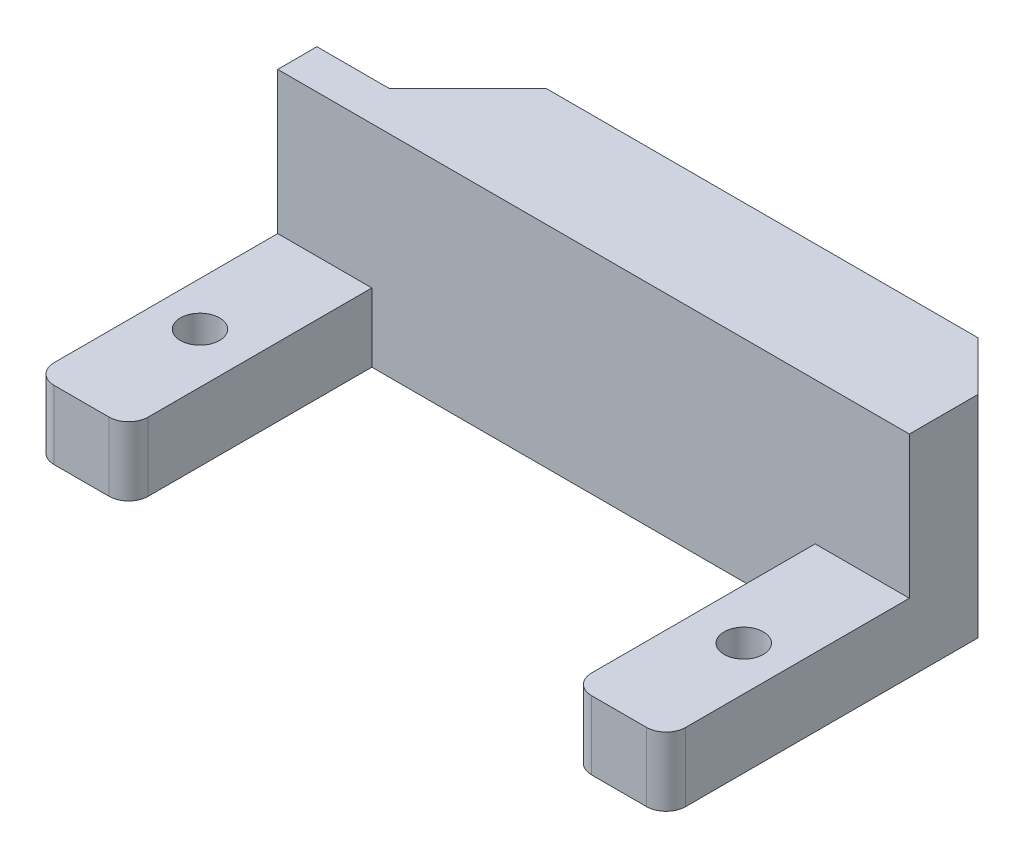
ISO-10303-21;
HEADER;
FILE_DESCRIPTION(('STEP AP214'),'2;1');
FILE_NAME('part.step','',(''),(''),'','','');
FILE_SCHEMA(('AUTOMOTIVE_DESIGN { 1 0 10303 214 1 1 1 1 }'));
ENDSEC;
DATA;
#1=APPLICATION_CONTEXT('core data for automotive mechanical design processes');
#2=APPLICATION_PROTOCOL_DEFINITION('international standard','automotive_design',2000,#1);
#3=PRODUCT_CONTEXT('',#1,'mechanical');
#4=PRODUCT('Part','Part','',(#3));
#5=PRODUCT_RELATED_PRODUCT_CATEGORY('part','',(#4));
#6=PRODUCT_DEFINITION_FORMATION('','',#4);
#7=PRODUCT_DEFINITION_CONTEXT('part definition',#1,'design');
#8=PRODUCT_DEFINITION('design','',#6,#7);
#9=PRODUCT_DEFINITION_SHAPE('','',#8);
#10=(LENGTH_UNIT() NAMED_UNIT(*) SI_UNIT(.MILLI.,.METRE.));
#11=(NAMED_UNIT(*) PLANE_ANGLE_UNIT() SI_UNIT($,.RADIAN.));
#12=(NAMED_UNIT(*) SI_UNIT($,.STERADIAN.) SOLID_ANGLE_UNIT());
#13=UNCERTAINTY_MEASURE_WITH_UNIT(LENGTH_MEASURE(1.E-05),#10,'distance_accuracy_value','');
#14=(GEOMETRIC_REPRESENTATION_CONTEXT(3) GLOBAL_UNCERTAINTY_ASSIGNED_CONTEXT((#13)) GLOBAL_UNIT_ASSIGNED_CONTEXT((#10,
#11,#12)) REPRESENTATION_CONTEXT('',''));
#15=CARTESIAN_POINT('',(0.,0.,0.));
#16=DIRECTION('',(0.,0.,1.));
#17=DIRECTION('',(1.,0.,0.));
#18=AXIS2_PLACEMENT_3D('',#15,#16,#17);
#19=CARTESIAN_POINT('',(12.8287010787249,25.306137529213,-5.11908373632079));
#20=DIRECTION('',(0.,-1.,0.));
#21=DIRECTION('',(0.,0.,1.));
#22=AXIS2_PLACEMENT_3D('',#19,#20,#21);
#23=PLANE('',#22);
#24=DIRECTION('',(-1.,0.,0.));
#25=VECTOR('',#24,1.);
#26=CARTESIAN_POINT('',(12.8287010787249,25.306137529213,-4.09908373632079));
#27=LINE('',#26,#25);
#28=CARTESIAN_POINT('',(13.8487010787249,25.306137529213,-4.09908373632079));
#29=VERTEX_POINT('',#28);
#30=CARTESIAN_POINT('',(-8.59129892127512,25.306137529213,-4.09908373632079));
#31=VERTEX_POINT('',#30);
#32=EDGE_CURVE('E202',#29,#31,#27,.T.);
#33=ORIENTED_EDGE('',*,*,#32,.T.);
#34=DIRECTION('',(-0.707106781186546,0.,0.707106781186549));
#35=VECTOR('',#34,1.);
#36=CARTESIAN_POINT('',(2.62870107872484,25.306137529213,-15.3190837363208));
#37=LINE('',#36,#35);
#38=CARTESIAN_POINT('',(-12.6712989212751,25.306137529213,-0.0190837363207937));
#39=VERTEX_POINT('',#38);
#40=EDGE_CURVE('E417',#39,#31,#37,.F.);
#41=ORIENTED_EDGE('',*,*,#40,.F.);
#42=DIRECTION('',(1.,0.,0.));
#43=VECTOR('',#42,1.);
#44=CARTESIAN_POINT('',(-0.02329892127513,25.306137529213,-0.0190837363207937));
#45=LINE('',#44,#43);
#46=CARTESIAN_POINT('',(-16.4452989212751,25.306137529213,-0.0190837363207937));
#47=VERTEX_POINT('',#46);
#48=EDGE_CURVE('E285',#47,#39,#45,.T.);
#49=ORIENTED_EDGE('',*,*,#48,.F.);
#50=DIRECTION('',(0.,0.,-1.));
#51=VECTOR('',#50,1.);
#52=CARTESIAN_POINT('',(-16.4452989212751,25.306137529213,14.6689162636792));
#53=LINE('',#52,#51);
#54=CARTESIAN_POINT('',(-16.4452989212751,25.306137529213,2.02091626367921));
#55=VERTEX_POINT('',#54);
#56=EDGE_CURVE('E290',#55,#47,#53,.T.);
#57=ORIENTED_EDGE('',*,*,#56,.F.);
#58=DIRECTION('',(1.,0.,0.));
#59=VECTOR('',#58,1.);
#60=CARTESIAN_POINT('',(-0.02329892127513,25.306137529213,2.02091626367921));
#61=LINE('',#60,#59);
#62=CARTESIAN_POINT('',(16.3987010787249,25.306137529213,2.02091626367921));
#63=VERTEX_POINT('',#62);
#64=EDGE_CURVE('E294',#55,#63,#61,.T.);
#65=ORIENTED_EDGE('',*,*,#64,.T.);
#66=DIRECTION('',(0.,0.,1.));
#67=VECTOR('',#66,1.);
#68=CARTESIAN_POINT('',(16.3987010787249,25.306137529213,14.6689162636792));
#69=LINE('',#68,#67);
#70=CARTESIAN_POINT('',(16.3987010787249,25.306137529213,-1.54908373632082));
#71=VERTEX_POINT('',#70);
#72=EDGE_CURVE('E284',#71,#63,#69,.T.);
#73=ORIENTED_EDGE('',*,*,#72,.F.);
#74=DIRECTION('',(-0.70710678118655,0.,-0.707106781186545));
#75=VECTOR('',#74,1.);
#76=CARTESIAN_POINT('',(12.8287010787249,25.306137529213,-5.11908373632079));
#77=LINE('',#76,#75);
#78=EDGE_CURVE('E421',#29,#71,#77,.F.);
#79=ORIENTED_EDGE('',*,*,#78,.F.);
#80=EDGE_LOOP('',(#33,#41,#49,#57,#65,#73,#79));
#81=FACE_BOUND('',#80,.T.);
#82=ADVANCED_FACE('F41',(#81),#23,.F.);
#83=CARTESIAN_POINT('',(-7.57129892127513,23.266137529213,-5.11908373632079));
#84=DIRECTION('',(-0.707106781186549,0.,-0.707106781186546));
#85=DIRECTION('',(0.,1.,0.));
#86=AXIS2_PLACEMENT_3D('',#83,#84,#85);
#87=PLANE('',#86);
#88=DIRECTION('',(0.,1.,0.));
#89=VECTOR('',#88,1.);
#90=CARTESIAN_POINT('',(-8.59129892127512,23.266137529213,-4.09908373632079));
#91=LINE('',#90,#89);
#92=CARTESIAN_POINT('',(-8.59129892127512,14.341137529213,-4.09908373632079));
#93=VERTEX_POINT('',#92);
#94=EDGE_CURVE('E204',#31,#93,#91,.F.);
#95=ORIENTED_EDGE('',*,*,#94,.T.);
#96=DIRECTION('',(-0.707106781186546,0.,0.707106781186549));
#97=VECTOR('',#96,1.);
#98=CARTESIAN_POINT('',(-7.57129892127513,14.341137529213,-5.11908373632079));
#99=LINE('',#98,#97);
#100=CARTESIAN_POINT('',(-12.6712989212751,14.341137529213,-0.0190837363207937));
#101=VERTEX_POINT('',#100);
#102=EDGE_CURVE('E189',#93,#101,#99,.T.);
#103=ORIENTED_EDGE('',*,*,#102,.T.);
#104=DIRECTION('',(0.,1.,0.));
#105=VECTOR('',#104,1.);
#106=CARTESIAN_POINT('',(-12.6712989212751,25.306137529213,-0.0190837363207937));
#107=LINE('',#106,#105);
#108=EDGE_CURVE('E414',#101,#39,#107,.T.);
#109=ORIENTED_EDGE('',*,*,#108,.T.);
#110=ORIENTED_EDGE('',*,*,#40,.T.);
#111=EDGE_LOOP('',(#95,#103,#109,#110));
#112=FACE_BOUND('',#111,.T.);
#113=ADVANCED_FACE('F463',(#112),#87,.T.);
#114=CARTESIAN_POINT('',(12.8287010787249,23.266137529213,-5.11908373632079));
#115=DIRECTION('',(0.707106781186545,0.,-0.70710678118655));
#116=DIRECTION('',(0.,-1.,0.));
#117=AXIS2_PLACEMENT_3D('',#114,#115,#116);
#118=PLANE('',#117);
#119=DIRECTION('',(0.,-1.,0.));
#120=VECTOR('',#119,1.);
#121=CARTESIAN_POINT('',(13.8487010787249,23.266137529213,-4.09908373632079));
#122=LINE('',#121,#120);
#123=CARTESIAN_POINT('',(13.8487010787249,14.341137529213,-4.09908373632079));
#124=VERTEX_POINT('',#123);
#125=EDGE_CURVE('E193',#124,#29,#122,.F.);
#126=ORIENTED_EDGE('',*,*,#125,.T.);
#127=ORIENTED_EDGE('',*,*,#78,.T.);
#128=DIRECTION('',(0.,1.,0.));
#129=VECTOR('',#128,1.);
#130=CARTESIAN_POINT('',(16.3987010787249,15.871137529213,-1.54908373632082));
#131=LINE('',#130,#129);
#132=CARTESIAN_POINT('',(16.3987010787249,14.341137529213,-1.54908373632082));
#133=VERTEX_POINT('',#132);
#134=EDGE_CURVE('E50',#71,#133,#131,.F.);
#135=ORIENTED_EDGE('',*,*,#134,.T.);
#136=DIRECTION('',(-0.70710678118655,0.,-0.707106781186545));
#137=VECTOR('',#136,1.);
#138=CARTESIAN_POINT('',(16.3987010787249,14.341137529213,-1.54908373632082));
#139=LINE('',#138,#137);
#140=EDGE_CURVE('E186',#133,#124,#139,.T.);
#141=ORIENTED_EDGE('',*,*,#140,.T.);
#142=EDGE_LOOP('',(#126,#127,#135,#141));
#143=FACE_BOUND('',#142,.T.);
#144=ADVANCED_FACE('F43',(#143),#118,.T.);
#145=CARTESIAN_POINT('',(15.3787010787249,14.341137529213,13.6489162636792));
#146=DIRECTION('',(0.,-1.,0.));
#147=DIRECTION('',(0.,0.,1.));
#148=AXIS2_PLACEMENT_3D('',#145,#146,#147);
#149=PLANE('',#148);
#150=CARTESIAN_POINT('',(14.1139010787249,14.341137529213,8.34802470056417));
#151=DIRECTION('',(0.,1.,0.));
#152=DIRECTION('',(0.,0.,1.));
#153=AXIS2_PLACEMENT_3D('',#150,#151,#152);
#154=CIRCLE('',#153,1.02);
#155=CARTESIAN_POINT('',(14.1139010787249,14.341137529213,9.36802470056417));
#156=VERTEX_POINT('',#155);
#157=EDGE_CURVE('E229',#156,#156,#154,.T.);
#158=ORIENTED_EDGE('',*,*,#157,.T.);
#159=EDGE_LOOP('',(#158));
#160=FACE_BOUND('',#159,.T.);
#161=CARTESIAN_POINT('',(-14.1604989212751,14.341137529213,8.34802470056417));
#162=DIRECTION('',(0.,1.,0.));
#163=DIRECTION('',(0.,0.,1.));
#164=AXIS2_PLACEMENT_3D('',#161,#162,#163);
#165=CIRCLE('',#164,1.02);
#166=CARTESIAN_POINT('',(-14.1604989212751,14.341137529213,9.36802470056417));
#167=VERTEX_POINT('',#166);
#168=EDGE_CURVE('E225',#167,#167,#165,.T.);
#169=ORIENTED_EDGE('',*,*,#168,.T.);
#170=EDGE_LOOP('',(#169));
#171=FACE_BOUND('',#170,.T.);
#172=ORIENTED_EDGE('',*,*,#140,.F.);
#173=DIRECTION('',(0.,0.,-1.));
#174=VECTOR('',#173,1.);
#175=CARTESIAN_POINT('',(16.3987010787249,14.341137529213,13.6489162636792));
#176=LINE('',#175,#174);
#177=CARTESIAN_POINT('',(16.3987010787249,14.341137529213,13.6489162636792));
#178=VERTEX_POINT('',#177);
#179=EDGE_CURVE('E196',#178,#133,#176,.T.);
#180=ORIENTED_EDGE('',*,*,#179,.F.);
#181=CARTESIAN_POINT('',(15.3787010787249,14.341137529213,13.6489162636792));
#182=DIRECTION('',(0.,1.,0.));
#183=DIRECTION('',(0.,0.,1.));
#184=AXIS2_PLACEMENT_3D('',#181,#182,#183);
#185=CIRCLE('',#184,1.02);
#186=CARTESIAN_POINT('',(15.3787010787249,14.341137529213,14.6689162636792));
#187=VERTEX_POINT('',#186);
#188=EDGE_CURVE('E233',#187,#178,#185,.T.);
#189=ORIENTED_EDGE('',*,*,#188,.F.);
#190=DIRECTION('',(1.,0.,0.));
#191=VECTOR('',#190,1.);
#192=CARTESIAN_POINT('',(12.5227010787249,14.341137529213,14.6689162636792));
#193=LINE('',#192,#191);
#194=CARTESIAN_POINT('',(12.5227010787249,14.341137529213,14.6689162636792));
#195=VERTEX_POINT('',#194);
#196=EDGE_CURVE('E277',#195,#187,#193,.T.);
#197=ORIENTED_EDGE('',*,*,#196,.F.);
#198=CARTESIAN_POINT('',(12.5227010787249,14.341137529213,13.6489162636792));
#199=DIRECTION('',(0.,1.,0.));
#200=DIRECTION('',(0.,0.,1.));
#201=AXIS2_PLACEMENT_3D('',#198,#199,#200);
#202=CIRCLE('',#201,1.02);
#203=CARTESIAN_POINT('',(11.5027010787249,14.341137529213,13.6489162636792));
#204=VERTEX_POINT('',#203);
#205=EDGE_CURVE('E273',#204,#195,#202,.T.);
#206=ORIENTED_EDGE('',*,*,#205,.F.);
#207=DIRECTION('',(0.,0.,1.));
#208=VECTOR('',#207,1.);
#209=CARTESIAN_POINT('',(11.5027010787249,14.341137529213,2.02091626367921));
#210=LINE('',#209,#208);
#211=CARTESIAN_POINT('',(11.5027010787249,14.341137529213,2.02091626367921));
#212=VERTEX_POINT('',#211);
#213=EDGE_CURVE('E269',#212,#204,#210,.T.);
#214=ORIENTED_EDGE('',*,*,#213,.F.);
#215=DIRECTION('',(1.,0.,0.));
#216=VECTOR('',#215,1.);
#217=CARTESIAN_POINT('',(-11.5492989212751,14.341137529213,2.02091626367921));
#218=LINE('',#217,#216);
#219=CARTESIAN_POINT('',(-11.5492989212751,14.341137529213,2.02091626367921));
#220=VERTEX_POINT('',#219);
#221=EDGE_CURVE('E265',#220,#212,#218,.T.);
#222=ORIENTED_EDGE('',*,*,#221,.F.);
#223=DIRECTION('',(0.,0.,-1.));
#224=VECTOR('',#223,1.);
#225=CARTESIAN_POINT('',(-11.5492989212751,14.341137529213,13.6489162636792));
#226=LINE('',#225,#224);
#227=CARTESIAN_POINT('',(-11.5492989212751,14.341137529213,13.6489162636792));
#228=VERTEX_POINT('',#227);
#229=EDGE_CURVE('E261',#228,#220,#226,.T.);
#230=ORIENTED_EDGE('',*,*,#229,.F.);
#231=CARTESIAN_POINT('',(-12.5692989212751,14.341137529213,13.6489162636792));
#232=DIRECTION('',(0.,1.,0.));
#233=DIRECTION('',(0.,0.,1.));
#234=AXIS2_PLACEMENT_3D('',#231,#232,#233);
#235=CIRCLE('',#234,1.02);
#236=CARTESIAN_POINT('',(-12.5692989212751,14.341137529213,14.6689162636792));
#237=VERTEX_POINT('',#236);
#238=EDGE_CURVE('E257',#237,#228,#235,.T.);
#239=ORIENTED_EDGE('',*,*,#238,.F.);
#240=DIRECTION('',(1.,0.,0.));
#241=VECTOR('',#240,1.);
#242=CARTESIAN_POINT('',(-15.4252989212751,14.341137529213,14.6689162636792));
#243=LINE('',#242,#241);
#244=CARTESIAN_POINT('',(-15.4252989212751,14.341137529213,14.6689162636792));
#245=VERTEX_POINT('',#244);
#246=EDGE_CURVE('E253',#245,#237,#243,.T.);
#247=ORIENTED_EDGE('',*,*,#246,.F.);
#248=CARTESIAN_POINT('',(-15.4252989212751,14.341137529213,13.6489162636792));
#249=DIRECTION('',(0.,1.,0.));
#250=DIRECTION('',(0.,0.,1.));
#251=AXIS2_PLACEMENT_3D('',#248,#249,#250);
#252=CIRCLE('',#251,1.02);
#253=CARTESIAN_POINT('',(-16.4452989212751,14.341137529213,13.6489162636792));
#254=VERTEX_POINT('',#253);
#255=EDGE_CURVE('E249',#254,#245,#252,.T.);
#256=ORIENTED_EDGE('',*,*,#255,.F.);
#257=DIRECTION('',(0.,0.,1.));
#258=VECTOR('',#257,1.);
#259=CARTESIAN_POINT('',(-16.4452989212751,14.341137529213,-0.0190837363207937));
#260=LINE('',#259,#258);
#261=CARTESIAN_POINT('',(-16.4452989212751,14.341137529213,-0.0190837363207937));
#262=VERTEX_POINT('',#261);
#263=EDGE_CURVE('E245',#262,#254,#260,.T.);
#264=ORIENTED_EDGE('',*,*,#263,.F.);
#265=DIRECTION('',(-1.,0.,0.));
#266=VECTOR('',#265,1.);
#267=CARTESIAN_POINT('',(-12.6712989212751,14.341137529213,-0.0190837363207937));
#268=LINE('',#267,#266);
#269=EDGE_CURVE('E241',#101,#262,#268,.T.);
#270=ORIENTED_EDGE('',*,*,#269,.F.);
#271=ORIENTED_EDGE('',*,*,#102,.F.);
#272=DIRECTION('',(-1.,0.,0.));
#273=VECTOR('',#272,1.);
#274=CARTESIAN_POINT('',(15.3787010787249,14.341137529213,-4.09908373632079));
#275=LINE('',#274,#273);
#276=EDGE_CURVE('E11',#124,#93,#275,.T.);
#277=ORIENTED_EDGE('',*,*,#276,.F.);
#278=EDGE_LOOP('',(#172,#180,#189,#197,#206,#214,#222,#230,#239,#247,#256,#264,#270,#271,#277));
#279=FACE_BOUND('',#278,.T.);
#280=ADVANCED_FACE('F184',(#160,#171,#279),#149,.T.);
#281=CARTESIAN_POINT('',(-0.02329892127513,28.8761375292131,-0.0190837363207937));
#282=DIRECTION('',(0.,0.,1.));
#283=DIRECTION('',(1.,0.,0.));
#284=AXIS2_PLACEMENT_3D('',#281,#282,#283);
#285=PLANE('',#284);
#286=DIRECTION('',(0.,1.,0.));
#287=VECTOR('',#286,1.);
#288=CARTESIAN_POINT('',(-16.4452989212751,15.871137529213,-0.0190837363207937));
#289=LINE('',#288,#287);
#290=EDGE_CURVE('E359',#262,#47,#289,.T.);
#291=ORIENTED_EDGE('',*,*,#290,.T.);
#292=ORIENTED_EDGE('',*,*,#48,.T.);
#293=ORIENTED_EDGE('',*,*,#108,.F.);
#294=ORIENTED_EDGE('',*,*,#269,.T.);
#295=EDGE_LOOP('',(#291,#292,#293,#294));
#296=FACE_BOUND('',#295,.T.);
#297=ADVANCED_FACE('F459',(#296),#285,.F.);
#298=CARTESIAN_POINT('',(16.3987010787249,15.871137529213,14.6689162636792));
#299=DIRECTION('',(-1.,0.,0.));
#300=DIRECTION('',(0.,0.,1.));
#301=AXIS2_PLACEMENT_3D('',#298,#299,#300);
#302=PLANE('',#301);
#303=ORIENTED_EDGE('',*,*,#72,.T.);
#304=DIRECTION('',(0.,-1.,0.));
#305=VECTOR('',#304,1.);
#306=CARTESIAN_POINT('',(16.3987010787249,17.9111375292131,2.02091626367921));
#307=LINE('',#306,#305);
#308=CARTESIAN_POINT('',(16.3987010787249,17.9111375292131,2.02091626367921));
#309=VERTEX_POINT('',#308);
#310=EDGE_CURVE('E341',#63,#309,#307,.T.);
#311=ORIENTED_EDGE('',*,*,#310,.T.);
#312=DIRECTION('',(0.,0.,1.));
#313=VECTOR('',#312,1.);
#314=CARTESIAN_POINT('',(16.3987010787249,17.9111375292131,2.02091626367921));
#315=LINE('',#314,#313);
#316=CARTESIAN_POINT('',(16.3987010787249,17.9111375292131,13.6489162636792));
#317=VERTEX_POINT('',#316);
#318=EDGE_CURVE('E351',#309,#317,#315,.T.);
#319=ORIENTED_EDGE('',*,*,#318,.T.);
#320=DIRECTION('',(0.,-1.,0.));
#321=VECTOR('',#320,1.);
#322=CARTESIAN_POINT('',(16.3987010787249,17.9111375292131,13.6489162636792));
#323=LINE('',#322,#321);
#324=EDGE_CURVE('E398',#178,#317,#323,.F.);
#325=ORIENTED_EDGE('',*,*,#324,.F.);
#326=ORIENTED_EDGE('',*,*,#179,.T.);
#327=ORIENTED_EDGE('',*,*,#134,.F.);
#328=EDGE_LOOP('',(#303,#311,#319,#325,#326,#327));
#329=FACE_BOUND('',#328,.T.);
#330=ADVANCED_FACE('F467',(#329),#302,.F.);
#331=CARTESIAN_POINT('',(-16.4452989212751,15.871137529213,14.6689162636792));
#332=DIRECTION('',(1.,0.,0.));
#333=DIRECTION('',(0.,-1.,0.));
#334=AXIS2_PLACEMENT_3D('',#331,#332,#333);
#335=PLANE('',#334);
#336=ORIENTED_EDGE('',*,*,#56,.T.);
#337=ORIENTED_EDGE('',*,*,#290,.F.);
#338=ORIENTED_EDGE('',*,*,#263,.T.);
#339=DIRECTION('',(0.,1.,0.));
#340=VECTOR('',#339,1.);
#341=CARTESIAN_POINT('',(-16.4452989212751,15.871137529213,13.6489162636792));
#342=LINE('',#341,#340);
#343=CARTESIAN_POINT('',(-16.4452989212751,17.9111375292131,13.6489162636792));
#344=VERTEX_POINT('',#343);
#345=EDGE_CURVE('E381',#344,#254,#342,.F.);
#346=ORIENTED_EDGE('',*,*,#345,.F.);
#347=DIRECTION('',(0.,0.,1.));
#348=VECTOR('',#347,1.);
#349=CARTESIAN_POINT('',(-16.4452989212751,17.9111375292131,2.02091626367921));
#350=LINE('',#349,#348);
#351=CARTESIAN_POINT('',(-16.4452989212751,17.9111375292131,2.02091626367921));
#352=VERTEX_POINT('',#351);
#353=EDGE_CURVE('E355',#352,#344,#350,.T.);
#354=ORIENTED_EDGE('',*,*,#353,.F.);
#355=DIRECTION('',(0.,1.,0.));
#356=VECTOR('',#355,1.);
#357=CARTESIAN_POINT('',(-16.4452989212751,17.9111375292131,2.02091626367921));
#358=LINE('',#357,#356);
#359=EDGE_CURVE('E338',#352,#55,#358,.T.);
#360=ORIENTED_EDGE('',*,*,#359,.T.);
#361=EDGE_LOOP('',(#336,#337,#338,#346,#354,#360));
#362=FACE_BOUND('',#361,.T.);
#363=ADVANCED_FACE('F456',(#362),#335,.F.);
#364=CARTESIAN_POINT('',(-0.02329892127513,28.8761375292131,2.02091626367921));
#365=DIRECTION('',(0.,0.,1.));
#366=DIRECTION('',(1.,0.,0.));
#367=AXIS2_PLACEMENT_3D('',#364,#365,#366);
#368=PLANE('',#367);
#369=DIRECTION('',(0.,-1.,0.));
#370=VECTOR('',#369,1.);
#371=CARTESIAN_POINT('',(-11.5492989212751,45.0982335844601,2.02091626367921));
#372=LINE('',#371,#370);
#373=CARTESIAN_POINT('',(-11.5492989212751,17.9111375292131,2.02091626367921));
#374=VERTEX_POINT('',#373);
#375=EDGE_CURVE('E281',#374,#220,#372,.T.);
#376=ORIENTED_EDGE('',*,*,#375,.T.);
#377=ORIENTED_EDGE('',*,*,#221,.T.);
#378=DIRECTION('',(0.,-1.,0.));
#379=VECTOR('',#378,1.);
#380=CARTESIAN_POINT('',(11.5027010787249,15.871137529213,2.02091626367921));
#381=LINE('',#380,#379);
#382=CARTESIAN_POINT('',(11.5027010787249,17.9111375292131,2.02091626367921));
#383=VERTEX_POINT('',#382);
#384=EDGE_CURVE('E405',#383,#212,#381,.T.);
#385=ORIENTED_EDGE('',*,*,#384,.F.);
#386=DIRECTION('',(-1.,0.,0.));
#387=VECTOR('',#386,1.);
#388=CARTESIAN_POINT('',(-16.4452989212751,17.9111375292131,2.02091626367921));
#389=LINE('',#388,#387);
#390=EDGE_CURVE('E347',#309,#383,#389,.T.);
#391=ORIENTED_EDGE('',*,*,#390,.F.);
#392=ORIENTED_EDGE('',*,*,#310,.F.);
#393=ORIENTED_EDGE('',*,*,#64,.F.);
#394=ORIENTED_EDGE('',*,*,#359,.F.);
#395=EDGE_CURVE('E346',#374,#352,#389,.T.);
#396=ORIENTED_EDGE('',*,*,#395,.F.);
#397=EDGE_LOOP('',(#376,#377,#385,#391,#392,#393,#394,#396));
#398=FACE_BOUND('',#397,.T.);
#399=ADVANCED_FACE('F452',(#398),#368,.T.);
#400=CARTESIAN_POINT('',(-0.02329892127513,28.8761375292131,14.6689162636792));
#401=DIRECTION('',(0.,0.,1.));
#402=DIRECTION('',(1.,0.,0.));
#403=AXIS2_PLACEMENT_3D('',#400,#401,#402);
#404=PLANE('',#403);
#405=DIRECTION('',(-1.,0.,0.));
#406=VECTOR('',#405,1.);
#407=CARTESIAN_POINT('',(-16.4452989212751,17.9111375292131,14.6689162636792));
#408=LINE('',#407,#406);
#409=CARTESIAN_POINT('',(15.3787010787249,17.9111375292131,14.6689162636792));
#410=VERTEX_POINT('',#409);
#411=CARTESIAN_POINT('',(12.5227010787249,17.9111375292131,14.6689162636792));
#412=VERTEX_POINT('',#411);
#413=EDGE_CURVE('E342',#410,#412,#408,.T.);
#414=ORIENTED_EDGE('',*,*,#413,.T.);
#415=DIRECTION('',(0.,1.,0.));
#416=VECTOR('',#415,1.);
#417=CARTESIAN_POINT('',(12.5227010787249,28.8761375292131,14.6689162636792));
#418=LINE('',#417,#416);
#419=EDGE_CURVE('E384',#195,#412,#418,.T.);
#420=ORIENTED_EDGE('',*,*,#419,.F.);
#421=ORIENTED_EDGE('',*,*,#196,.T.);
#422=DIRECTION('',(0.,-1.,0.));
#423=VECTOR('',#422,1.);
#424=CARTESIAN_POINT('',(15.3787010787249,15.871137529213,14.6689162636792));
#425=LINE('',#424,#423);
#426=EDGE_CURVE('E395',#410,#187,#425,.T.);
#427=ORIENTED_EDGE('',*,*,#426,.F.);
#428=EDGE_LOOP('',(#414,#420,#421,#427));
#429=FACE_BOUND('',#428,.T.);
#430=ADVANCED_FACE('F476',(#429),#404,.T.);
#431=CARTESIAN_POINT('',(-16.4452989212751,17.9111375292131,2.02091626367921));
#432=DIRECTION('',(0.,-1.,0.));
#433=DIRECTION('',(0.,0.,1.));
#434=AXIS2_PLACEMENT_3D('',#431,#432,#433);
#435=PLANE('',#434);
#436=CARTESIAN_POINT('',(14.1139010787249,17.9111375292131,8.34802470056417));
#437=DIRECTION('',(0.,1.,0.));
#438=DIRECTION('',(0.,0.,1.));
#439=AXIS2_PLACEMENT_3D('',#436,#437,#438);
#440=CIRCLE('',#439,1.02);
#441=CARTESIAN_POINT('',(14.1139010787249,17.9111375292131,9.36802470056417));
#442=VERTEX_POINT('',#441);
#443=EDGE_CURVE('E327',#442,#442,#440,.F.);
#444=ORIENTED_EDGE('',*,*,#443,.T.);
#445=EDGE_LOOP('',(#444));
#446=FACE_BOUND('',#445,.T.);
#447=ORIENTED_EDGE('',*,*,#318,.F.);
#448=ORIENTED_EDGE('',*,*,#390,.T.);
#449=DIRECTION('',(0.,0.,1.));
#450=VECTOR('',#449,1.);
#451=CARTESIAN_POINT('',(11.5027010787249,17.9111375292131,-0.0190837363207937));
#452=LINE('',#451,#450);
#453=CARTESIAN_POINT('',(11.5027010787249,17.9111375292131,13.6489162636792));
#454=VERTEX_POINT('',#453);
#455=EDGE_CURVE('E333',#383,#454,#452,.T.);
#456=ORIENTED_EDGE('',*,*,#455,.T.);
#457=CARTESIAN_POINT('',(12.5227010787249,17.9111375292131,13.6489162636792));
#458=DIRECTION('',(0.,1.,0.));
#459=DIRECTION('',(0.,0.,1.));
#460=AXIS2_PLACEMENT_3D('',#457,#458,#459);
#461=CIRCLE('',#460,1.02);
#462=EDGE_CURVE('E388',#412,#454,#461,.F.);
#463=ORIENTED_EDGE('',*,*,#462,.F.);
#464=ORIENTED_EDGE('',*,*,#413,.F.);
#465=CARTESIAN_POINT('',(15.3787010787249,17.9111375292131,13.6489162636792));
#466=DIRECTION('',(0.,1.,0.));
#467=DIRECTION('',(0.,0.,1.));
#468=AXIS2_PLACEMENT_3D('',#465,#466,#467);
#469=CIRCLE('',#468,1.02);
#470=EDGE_CURVE('E402',#317,#410,#469,.F.);
#471=ORIENTED_EDGE('',*,*,#470,.F.);
#472=EDGE_LOOP('',(#447,#448,#456,#463,#464,#471));
#473=FACE_BOUND('',#472,.T.);
#474=ADVANCED_FACE('F485',(#446,#473),#435,.F.);
#475=DIRECTION('',(0.,1.,0.));
#476=VECTOR('',#475,1.);
#477=CARTESIAN_POINT('',(-12.5692989212751,15.871137529213,14.6689162636792));
#478=LINE('',#477,#476);
#479=CARTESIAN_POINT('',(-12.5692989212751,17.9111375292131,14.6689162636792));
#480=VERTEX_POINT('',#479);
#481=EDGE_CURVE('E371',#480,#237,#478,.F.);
#482=ORIENTED_EDGE('',*,*,#481,.F.);
#483=CARTESIAN_POINT('',(-15.4252989212751,17.9111375292131,14.6689162636792));
#484=VERTEX_POINT('',#483);
#485=EDGE_CURVE('E332',#480,#484,#408,.T.);
#486=ORIENTED_EDGE('',*,*,#485,.T.);
#487=DIRECTION('',(0.,1.,0.));
#488=VECTOR('',#487,1.);
#489=CARTESIAN_POINT('',(-15.4252989212751,17.9111375292131,14.6689162636792));
#490=LINE('',#489,#488);
#491=EDGE_CURVE('E374',#245,#484,#490,.T.);
#492=ORIENTED_EDGE('',*,*,#491,.F.);
#493=ORIENTED_EDGE('',*,*,#246,.T.);
#494=EDGE_LOOP('',(#482,#486,#492,#493));
#495=FACE_BOUND('',#494,.T.);
#496=ADVANCED_FACE('F430',(#495),#404,.T.);
#497=CARTESIAN_POINT('',(-14.1604989212751,17.9111375292131,8.34802470056417));
#498=DIRECTION('',(0.,1.,0.));
#499=DIRECTION('',(0.,0.,1.));
#500=AXIS2_PLACEMENT_3D('',#497,#498,#499);
#501=CIRCLE('',#500,1.02);
#502=CARTESIAN_POINT('',(-14.1604989212751,17.9111375292131,9.36802470056417));
#503=VERTEX_POINT('',#502);
#504=EDGE_CURVE('E337',#503,#503,#501,.T.);
#505=ORIENTED_EDGE('',*,*,#504,.F.);
#506=EDGE_LOOP('',(#505));
#507=FACE_BOUND('',#506,.T.);
#508=ORIENTED_EDGE('',*,*,#485,.F.);
#509=CARTESIAN_POINT('',(-12.5692989212751,17.9111375292131,13.6489162636792));
#510=DIRECTION('',(0.,1.,0.));
#511=DIRECTION('',(0.,0.,1.));
#512=AXIS2_PLACEMENT_3D('',#509,#510,#511);
#513=CIRCLE('',#512,1.02);
#514=CARTESIAN_POINT('',(-11.5492989212751,17.9111375292131,13.6489162636792));
#515=VERTEX_POINT('',#514);
#516=EDGE_CURVE('E368',#515,#480,#513,.F.);
#517=ORIENTED_EDGE('',*,*,#516,.F.);
#518=DIRECTION('',(0.,0.,1.));
#519=VECTOR('',#518,1.);
#520=CARTESIAN_POINT('',(-11.5492989212751,17.9111375292131,-0.0190837363207937));
#521=LINE('',#520,#519);
#522=EDGE_CURVE('E328',#374,#515,#521,.T.);
#523=ORIENTED_EDGE('',*,*,#522,.F.);
#524=ORIENTED_EDGE('',*,*,#395,.T.);
#525=ORIENTED_EDGE('',*,*,#353,.T.);
#526=CARTESIAN_POINT('',(-15.4252989212751,17.9111375292131,13.6489162636792));
#527=DIRECTION('',(0.,1.,0.));
#528=DIRECTION('',(0.,0.,1.));
#529=AXIS2_PLACEMENT_3D('',#526,#527,#528);
#530=CIRCLE('',#529,1.02);
#531=EDGE_CURVE('E378',#484,#344,#530,.F.);
#532=ORIENTED_EDGE('',*,*,#531,.F.);
#533=EDGE_LOOP('',(#508,#517,#523,#524,#525,#532));
#534=FACE_BOUND('',#533,.T.);
#535=ADVANCED_FACE('F433',(#507,#534),#435,.F.);
#536=CARTESIAN_POINT('',(-11.5492989212751,15.871137529213,-0.0190837363207937));
#537=DIRECTION('',(-1.,0.,0.));
#538=DIRECTION('',(0.,0.,1.));
#539=AXIS2_PLACEMENT_3D('',#536,#537,#538);
#540=PLANE('',#539);
#541=ORIENTED_EDGE('',*,*,#522,.T.);
#542=DIRECTION('',(0.,1.,0.));
#543=VECTOR('',#542,1.);
#544=CARTESIAN_POINT('',(-11.5492989212751,17.9111375292131,13.6489162636792));
#545=LINE('',#544,#543);
#546=EDGE_CURVE('E365',#228,#515,#545,.T.);
#547=ORIENTED_EDGE('',*,*,#546,.F.);
#548=ORIENTED_EDGE('',*,*,#229,.T.);
#549=ORIENTED_EDGE('',*,*,#375,.F.);
#550=EDGE_LOOP('',(#541,#547,#548,#549));
#551=FACE_BOUND('',#550,.T.);
#552=ADVANCED_FACE('F448',(#551),#540,.F.);
#553=CARTESIAN_POINT('',(11.5027010787249,15.871137529213,-0.0190837363207937));
#554=DIRECTION('',(-1.,0.,0.));
#555=DIRECTION('',(0.,0.,1.));
#556=AXIS2_PLACEMENT_3D('',#553,#554,#555);
#557=PLANE('',#556);
#558=ORIENTED_EDGE('',*,*,#384,.T.);
#559=ORIENTED_EDGE('',*,*,#213,.T.);
#560=DIRECTION('',(0.,1.,0.));
#561=VECTOR('',#560,1.);
#562=CARTESIAN_POINT('',(11.5027010787249,15.871137529213,13.6489162636792));
#563=LINE('',#562,#561);
#564=EDGE_CURVE('E392',#454,#204,#563,.F.);
#565=ORIENTED_EDGE('',*,*,#564,.F.);
#566=ORIENTED_EDGE('',*,*,#455,.F.);
#567=EDGE_LOOP('',(#558,#559,#565,#566));
#568=FACE_BOUND('',#567,.T.);
#569=ADVANCED_FACE('F481',(#568),#557,.T.);
#570=CARTESIAN_POINT('',(-12.5692989212751,15.871137529213,13.6489162636792));
#571=DIRECTION('',(0.,-1.,0.));
#572=DIRECTION('',(0.,0.,1.));
#573=AXIS2_PLACEMENT_3D('',#570,#571,#572);
#574=CYLINDRICAL_SURFACE('',#573,1.02);
#575=ORIENTED_EDGE('',*,*,#546,.T.);
#576=ORIENTED_EDGE('',*,*,#516,.T.);
#577=ORIENTED_EDGE('',*,*,#481,.T.);
#578=ORIENTED_EDGE('',*,*,#238,.T.);
#579=EDGE_LOOP('',(#575,#576,#577,#578));
#580=FACE_BOUND('',#579,.T.);
#581=ADVANCED_FACE('F445',(#580),#574,.T.);
#582=CARTESIAN_POINT('',(-15.4252989212751,28.8761375292131,13.6489162636792));
#583=DIRECTION('',(0.,-1.,0.));
#584=DIRECTION('',(-1.,0.,0.));
#585=AXIS2_PLACEMENT_3D('',#582,#583,#584);
#586=CYLINDRICAL_SURFACE('',#585,1.02);
#587=ORIENTED_EDGE('',*,*,#491,.T.);
#588=ORIENTED_EDGE('',*,*,#531,.T.);
#589=ORIENTED_EDGE('',*,*,#345,.T.);
#590=ORIENTED_EDGE('',*,*,#255,.T.);
#591=EDGE_LOOP('',(#587,#588,#589,#590));
#592=FACE_BOUND('',#591,.T.);
#593=ADVANCED_FACE('F437',(#592),#586,.T.);
#594=CARTESIAN_POINT('',(12.5227010787249,28.8761375292131,13.6489162636792));
#595=DIRECTION('',(0.,1.,0.));
#596=DIRECTION('',(0.,0.,-1.));
#597=AXIS2_PLACEMENT_3D('',#594,#595,#596);
#598=CYLINDRICAL_SURFACE('',#597,1.02);
#599=ORIENTED_EDGE('',*,*,#419,.T.);
#600=ORIENTED_EDGE('',*,*,#462,.T.);
#601=ORIENTED_EDGE('',*,*,#564,.T.);
#602=ORIENTED_EDGE('',*,*,#205,.T.);
#603=EDGE_LOOP('',(#599,#600,#601,#602));
#604=FACE_BOUND('',#603,.T.);
#605=ADVANCED_FACE('F478',(#604),#598,.T.);
#606=CARTESIAN_POINT('',(15.3787010787249,28.8761375292131,13.6489162636792));
#607=DIRECTION('',(0.,1.,0.));
#608=DIRECTION('',(0.,0.,-1.));
#609=AXIS2_PLACEMENT_3D('',#606,#607,#608);
#610=CYLINDRICAL_SURFACE('',#609,1.02);
#611=ORIENTED_EDGE('',*,*,#470,.T.);
#612=ORIENTED_EDGE('',*,*,#426,.T.);
#613=ORIENTED_EDGE('',*,*,#188,.T.);
#614=ORIENTED_EDGE('',*,*,#324,.T.);
#615=EDGE_LOOP('',(#611,#612,#613,#614));
#616=FACE_BOUND('',#615,.T.);
#617=ADVANCED_FACE('F472',(#616),#610,.T.);
#618=CARTESIAN_POINT('',(-14.1604989212751,26.071137529213,8.34802470056417));
#619=DIRECTION('',(0.,-1.,0.));
#620=DIRECTION('',(0.,0.,1.));
#621=AXIS2_PLACEMENT_3D('',#618,#619,#620);
#622=CYLINDRICAL_SURFACE('',#621,1.02);
#623=ORIENTED_EDGE('',*,*,#504,.T.);
#624=EDGE_LOOP('',(#623));
#625=FACE_BOUND('',#624,.T.);
#626=ORIENTED_EDGE('',*,*,#168,.F.);
#627=EDGE_LOOP('',(#626));
#628=FACE_BOUND('',#627,.T.);
#629=ADVANCED_FACE('F509',(#625,#628),#622,.F.);
#630=CARTESIAN_POINT('',(14.1139010787249,26.071137529213,8.34802470056417));
#631=DIRECTION('',(0.,-1.,0.));
#632=DIRECTION('',(0.,0.,1.));
#633=AXIS2_PLACEMENT_3D('',#630,#631,#632);
#634=CYLINDRICAL_SURFACE('',#633,1.02);
#635=ORIENTED_EDGE('',*,*,#443,.F.);
#636=EDGE_LOOP('',(#635));
#637=FACE_BOUND('',#636,.T.);
#638=ORIENTED_EDGE('',*,*,#157,.F.);
#639=EDGE_LOOP('',(#638));
#640=FACE_BOUND('',#639,.T.);
#641=ADVANCED_FACE('F506',(#637,#640),#634,.F.);
#642=CARTESIAN_POINT('',(-0.02329892127513,28.8761375292131,-4.09908373632079));
#643=DIRECTION('',(0.,0.,-1.));
#644=DIRECTION('',(-1.,0.,0.));
#645=AXIS2_PLACEMENT_3D('',#642,#643,#644);
#646=PLANE('',#645);
#647=ORIENTED_EDGE('',*,*,#32,.F.);
#648=ORIENTED_EDGE('',*,*,#125,.F.);
#649=ORIENTED_EDGE('',*,*,#276,.T.);
#650=ORIENTED_EDGE('',*,*,#94,.F.);
#651=EDGE_LOOP('',(#647,#648,#649,#650));
#652=FACE_BOUND('',#651,.T.);
#653=DIRECTION('',(1.,0.,0.));
#654=VECTOR('',#653,1.);
#655=CARTESIAN_POINT('',(12.8287010787249,23.266137529213,-4.09908373632079));
#656=LINE('',#655,#654);
#657=CARTESIAN_POINT('',(-6.55129892127513,23.266137529213,-4.09908373632079));
#658=VERTEX_POINT('',#657);
#659=CARTESIAN_POINT('',(11.8087010787249,23.266137529213,-4.09908373632079));
#660=VERTEX_POINT('',#659);
#661=EDGE_CURVE('E221',#658,#660,#656,.T.);
#662=ORIENTED_EDGE('',*,*,#661,.F.);
#663=DIRECTION('',(0.,1.,0.));
#664=VECTOR('',#663,1.);
#665=CARTESIAN_POINT('',(-6.55129892127513,21.736137529213,-4.09908373632079));
#666=LINE('',#665,#664);
#667=CARTESIAN_POINT('',(-6.55129892127513,21.736137529213,-4.09908373632079));
#668=VERTEX_POINT('',#667);
#669=EDGE_CURVE('E211',#668,#658,#666,.T.);
#670=ORIENTED_EDGE('',*,*,#669,.F.);
#671=DIRECTION('',(-1.,0.,0.));
#672=VECTOR('',#671,1.);
#673=CARTESIAN_POINT('',(11.8087010787249,21.736137529213,-4.09908373632079));
#674=LINE('',#673,#672);
#675=CARTESIAN_POINT('',(11.8087010787249,21.736137529213,-4.09908373632079));
#676=VERTEX_POINT('',#675);
#677=EDGE_CURVE('E214',#676,#668,#674,.T.);
#678=ORIENTED_EDGE('',*,*,#677,.F.);
#679=DIRECTION('',(0.,-1.,0.));
#680=VECTOR('',#679,1.);
#681=CARTESIAN_POINT('',(11.8087010787249,21.736137529213,-4.09908373632079));
#682=LINE('',#681,#680);
#683=EDGE_CURVE('E217',#660,#676,#682,.T.);
#684=ORIENTED_EDGE('',*,*,#683,.F.);
#685=EDGE_LOOP('',(#662,#670,#678,#684));
#686=FACE_BOUND('',#685,.T.);
#687=ADVANCED_FACE('F199',(#652,#686),#646,.T.);
#688=DIRECTION('',(0.,-1.,0.));
#689=VECTOR('',#688,1.);
#690=CARTESIAN_POINT('',(11.8087010787249,21.736137529213,-0.0190837363207937));
#691=LINE('',#690,#689);
#692=CARTESIAN_POINT('',(11.8087010787249,23.266137529213,-0.0190837363207937));
#693=VERTEX_POINT('',#692);
#694=CARTESIAN_POINT('',(11.8087010787249,21.736137529213,-0.0190837363207937));
#695=VERTEX_POINT('',#694);
#696=EDGE_CURVE('E289',#693,#695,#691,.T.);
#697=ORIENTED_EDGE('',*,*,#696,.T.);
#698=DIRECTION('',(-1.,0.,0.));
#699=VECTOR('',#698,1.);
#700=CARTESIAN_POINT('',(11.8087010787249,21.736137529213,-0.0190837363207937));
#701=LINE('',#700,#699);
#702=CARTESIAN_POINT('',(-6.55129892127513,21.736137529213,-0.0190837363207937));
#703=VERTEX_POINT('',#702);
#704=EDGE_CURVE('E304',#695,#703,#701,.T.);
#705=ORIENTED_EDGE('',*,*,#704,.T.);
#706=DIRECTION('',(0.,1.,0.));
#707=VECTOR('',#706,1.);
#708=CARTESIAN_POINT('',(-6.55129892127513,21.736137529213,-0.0190837363207937));
#709=LINE('',#708,#707);
#710=CARTESIAN_POINT('',(-6.55129892127513,23.266137529213,-0.0190837363207937));
#711=VERTEX_POINT('',#710);
#712=EDGE_CURVE('E308',#703,#711,#709,.T.);
#713=ORIENTED_EDGE('',*,*,#712,.T.);
#714=DIRECTION('',(1.,0.,0.));
#715=VECTOR('',#714,1.);
#716=CARTESIAN_POINT('',(12.8287010787249,23.266137529213,-0.0190837363207937));
#717=LINE('',#716,#715);
#718=EDGE_CURVE('E323',#711,#693,#717,.T.);
#719=ORIENTED_EDGE('',*,*,#718,.T.);
#720=EDGE_LOOP('',(#697,#705,#713,#719));
#721=FACE_BOUND('',#720,.T.);
#722=ADVANCED_FACE('F527',(#721),#285,.F.);
#723=CARTESIAN_POINT('',(-6.55129892127513,21.736137529213,-5.11908373632079));
#724=DIRECTION('',(-1.,0.,0.));
#725=DIRECTION('',(0.,0.,1.));
#726=AXIS2_PLACEMENT_3D('',#723,#724,#725);
#727=PLANE('',#726);
#728=ORIENTED_EDGE('',*,*,#669,.T.);
#729=DIRECTION('',(0.,0.,1.));
#730=VECTOR('',#729,1.);
#731=CARTESIAN_POINT('',(-6.55129892127513,23.266137529213,-5.11908373632079));
#732=LINE('',#731,#730);
#733=EDGE_CURVE('E312',#658,#711,#732,.T.);
#734=ORIENTED_EDGE('',*,*,#733,.T.);
#735=ORIENTED_EDGE('',*,*,#712,.F.);
#736=DIRECTION('',(0.,0.,1.));
#737=VECTOR('',#736,1.);
#738=CARTESIAN_POINT('',(-6.55129892127513,21.736137529213,-5.11908373632079));
#739=LINE('',#738,#737);
#740=EDGE_CURVE('E57',#668,#703,#739,.T.);
#741=ORIENTED_EDGE('',*,*,#740,.F.);
#742=EDGE_LOOP('',(#728,#734,#735,#741));
#743=FACE_BOUND('',#742,.T.);
#744=ADVANCED_FACE('F564',(#743),#727,.F.);
#745=CARTESIAN_POINT('',(11.8087010787249,21.736137529213,-5.11908373632079));
#746=DIRECTION('',(0.,-1.,0.));
#747=DIRECTION('',(0.,0.,1.));
#748=AXIS2_PLACEMENT_3D('',#745,#746,#747);
#749=PLANE('',#748);
#750=ORIENTED_EDGE('',*,*,#677,.T.);
#751=ORIENTED_EDGE('',*,*,#740,.T.);
#752=ORIENTED_EDGE('',*,*,#704,.F.);
#753=DIRECTION('',(0.,0.,1.));
#754=VECTOR('',#753,1.);
#755=CARTESIAN_POINT('',(11.8087010787249,21.736137529213,-5.11908373632079));
#756=LINE('',#755,#754);
#757=EDGE_CURVE('E317',#676,#695,#756,.T.);
#758=ORIENTED_EDGE('',*,*,#757,.F.);
#759=EDGE_LOOP('',(#750,#751,#752,#758));
#760=FACE_BOUND('',#759,.T.);
#761=ADVANCED_FACE('F572',(#760),#749,.F.);
#762=CARTESIAN_POINT('',(11.8087010787249,21.736137529213,-5.11908373632079));
#763=DIRECTION('',(1.,0.,0.));
#764=DIRECTION('',(0.,0.,-1.));
#765=AXIS2_PLACEMENT_3D('',#762,#763,#764);
#766=PLANE('',#765);
#767=ORIENTED_EDGE('',*,*,#683,.T.);
#768=ORIENTED_EDGE('',*,*,#757,.T.);
#769=ORIENTED_EDGE('',*,*,#696,.F.);
#770=DIRECTION('',(0.,0.,1.));
#771=VECTOR('',#770,1.);
#772=CARTESIAN_POINT('',(11.8087010787249,23.266137529213,-5.11908373632079));
#773=LINE('',#772,#771);
#774=EDGE_CURVE('E320',#660,#693,#773,.T.);
#775=ORIENTED_EDGE('',*,*,#774,.F.);
#776=EDGE_LOOP('',(#767,#768,#769,#775));
#777=FACE_BOUND('',#776,.T.);
#778=ADVANCED_FACE('F580',(#777),#766,.F.);
#779=CARTESIAN_POINT('',(12.8287010787249,23.266137529213,-5.11908373632079));
#780=DIRECTION('',(0.,1.,0.));
#781=DIRECTION('',(0.,0.,-1.));
#782=AXIS2_PLACEMENT_3D('',#779,#780,#781);
#783=PLANE('',#782);
#784=ORIENTED_EDGE('',*,*,#661,.T.);
#785=ORIENTED_EDGE('',*,*,#774,.T.);
#786=ORIENTED_EDGE('',*,*,#718,.F.);
#787=ORIENTED_EDGE('',*,*,#733,.F.);
#788=EDGE_LOOP('',(#784,#785,#786,#787));
#789=FACE_BOUND('',#788,.T.);
#790=ADVANCED_FACE('F504',(#789),#783,.F.);
#791=CLOSED_SHELL('',(#82,#113,#144,#280,#297,#330,#363,#399,#430,#474,#496,#535,#552,#569,#581,
#593,#605,#617,#629,#641,#687,#722,#744,#761,#778,#790));
#792=MANIFOLD_SOLID_BREP('B2',#791);
#793=ADVANCED_BREP_SHAPE_REPRESENTATION('',(#18,#792),#14);
#794=SHAPE_DEFINITION_REPRESENTATION(#9,#793);
ENDSEC;
END-ISO-10303-21;
